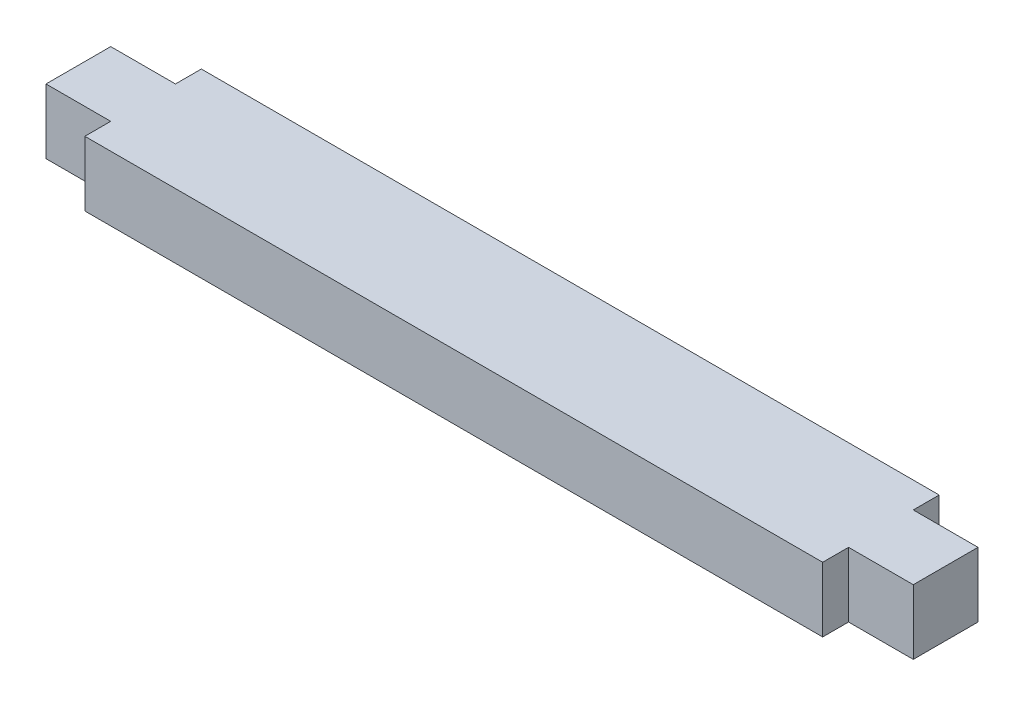
ISO-10303-21;
HEADER;
FILE_DESCRIPTION(('STEP AP214'),'2;1');
FILE_NAME('part.step','',(''),(''),'','','');
FILE_SCHEMA(('AUTOMOTIVE_DESIGN { 1 0 10303 214 1 1 1 1 }'));
ENDSEC;
DATA;
#1=APPLICATION_CONTEXT('core data for automotive mechanical design processes');
#2=APPLICATION_PROTOCOL_DEFINITION('international standard','automotive_design',2000,#1);
#3=PRODUCT_CONTEXT('',#1,'mechanical');
#4=PRODUCT('Part','Part','',(#3));
#5=PRODUCT_RELATED_PRODUCT_CATEGORY('part','',(#4));
#6=PRODUCT_DEFINITION_FORMATION('','',#4);
#7=PRODUCT_DEFINITION_CONTEXT('part definition',#1,'design');
#8=PRODUCT_DEFINITION('design','',#6,#7);
#9=PRODUCT_DEFINITION_SHAPE('','',#8);
#10=(LENGTH_UNIT() NAMED_UNIT(*) SI_UNIT(.MILLI.,.METRE.));
#11=(NAMED_UNIT(*) PLANE_ANGLE_UNIT() SI_UNIT($,.RADIAN.));
#12=(NAMED_UNIT(*) SI_UNIT($,.STERADIAN.) SOLID_ANGLE_UNIT());
#13=UNCERTAINTY_MEASURE_WITH_UNIT(LENGTH_MEASURE(1.E-05),#10,'distance_accuracy_value','');
#14=(GEOMETRIC_REPRESENTATION_CONTEXT(3) GLOBAL_UNCERTAINTY_ASSIGNED_CONTEXT((#13)) GLOBAL_UNIT_ASSIGNED_CONTEXT((#10,
#11,#12)) REPRESENTATION_CONTEXT('',''));
#15=CARTESIAN_POINT('',(0.,0.,0.));
#16=DIRECTION('',(0.,0.,1.));
#17=DIRECTION('',(1.,0.,0.));
#18=AXIS2_PLACEMENT_3D('',#15,#16,#17);
#19=CARTESIAN_POINT('',(36.195,6.35,3.17500000000001));
#20=DIRECTION('',(-1.,0.,0.));
#21=DIRECTION('',(0.,0.,1.));
#22=AXIS2_PLACEMENT_3D('',#19,#20,#21);
#23=PLANE('',#22);
#24=DIRECTION('',(0.,0.,-1.));
#25=VECTOR('',#24,1.);
#26=CARTESIAN_POINT('',(36.195,0.,3.17500000000001));
#27=LINE('',#26,#25);
#28=CARTESIAN_POINT('',(36.195,0.,5.71500000000002));
#29=VERTEX_POINT('',#28);
#30=CARTESIAN_POINT('',(36.195,0.,3.17500000000001));
#31=VERTEX_POINT('',#30);
#32=EDGE_CURVE('E153',#29,#31,#27,.T.);
#33=ORIENTED_EDGE('',*,*,#32,.T.);
#34=DIRECTION('',(0.,-1.,0.));
#35=VECTOR('',#34,1.);
#36=CARTESIAN_POINT('',(36.195,6.35,3.17500000000001));
#37=LINE('',#36,#35);
#38=CARTESIAN_POINT('',(36.195,6.35,3.17500000000001));
#39=VERTEX_POINT('',#38);
#40=EDGE_CURVE('E11',#39,#31,#37,.T.);
#41=ORIENTED_EDGE('',*,*,#40,.F.);
#42=DIRECTION('',(0.,0.,-1.));
#43=VECTOR('',#42,1.);
#44=CARTESIAN_POINT('',(36.195,6.35,3.17500000000001));
#45=LINE('',#44,#43);
#46=CARTESIAN_POINT('',(36.195,6.35,5.71500000000002));
#47=VERTEX_POINT('',#46);
#48=EDGE_CURVE('E175',#47,#39,#45,.T.);
#49=ORIENTED_EDGE('',*,*,#48,.F.);
#50=DIRECTION('',(0.,-1.,0.));
#51=VECTOR('',#50,1.);
#52=CARTESIAN_POINT('',(36.195,6.35,5.71500000000002));
#53=LINE('',#52,#51);
#54=EDGE_CURVE('E149',#47,#29,#53,.T.);
#55=ORIENTED_EDGE('',*,*,#54,.T.);
#56=EDGE_LOOP('',(#33,#41,#49,#55));
#57=FACE_BOUND('',#56,.T.);
#58=ADVANCED_FACE('F33',(#57),#23,.F.);
#59=CARTESIAN_POINT('',(36.195,6.35,3.17500000000001));
#60=DIRECTION('',(0.,0.,-1.));
#61=DIRECTION('',(-1.,0.,0.));
#62=AXIS2_PLACEMENT_3D('',#59,#60,#61);
#63=PLANE('',#62);
#64=DIRECTION('',(1.,0.,0.));
#65=VECTOR('',#64,1.);
#66=CARTESIAN_POINT('',(36.195,0.,3.17500000000001));
#67=LINE('',#66,#65);
#68=CARTESIAN_POINT('',(42.545,0.,3.17500000000001));
#69=VERTEX_POINT('',#68);
#70=EDGE_CURVE('E156',#31,#69,#67,.T.);
#71=ORIENTED_EDGE('',*,*,#70,.T.);
#72=DIRECTION('',(0.,-1.,0.));
#73=VECTOR('',#72,1.);
#74=CARTESIAN_POINT('',(42.545,6.35,3.17500000000001));
#75=LINE('',#74,#73);
#76=CARTESIAN_POINT('',(42.545,6.35,3.17500000000001));
#77=VERTEX_POINT('',#76);
#78=EDGE_CURVE('E41',#77,#69,#75,.T.);
#79=ORIENTED_EDGE('',*,*,#78,.F.);
#80=DIRECTION('',(1.,0.,0.));
#81=VECTOR('',#80,1.);
#82=CARTESIAN_POINT('',(36.195,6.35,3.17500000000001));
#83=LINE('',#82,#81);
#84=EDGE_CURVE('E104',#39,#77,#83,.T.);
#85=ORIENTED_EDGE('',*,*,#84,.F.);
#86=ORIENTED_EDGE('',*,*,#40,.T.);
#87=EDGE_LOOP('',(#71,#79,#85,#86));
#88=FACE_BOUND('',#87,.T.);
#89=ADVANCED_FACE('F253',(#88),#63,.F.);
#90=CARTESIAN_POINT('',(42.545,6.35,-3.17499999999999));
#91=DIRECTION('',(-1.,0.,0.));
#92=DIRECTION('',(0.,0.,1.));
#93=AXIS2_PLACEMENT_3D('',#90,#91,#92);
#94=PLANE('',#93);
#95=DIRECTION('',(0.,0.,-1.));
#96=VECTOR('',#95,1.);
#97=CARTESIAN_POINT('',(42.545,0.,-3.17499999999999));
#98=LINE('',#97,#96);
#99=CARTESIAN_POINT('',(42.545,0.,-3.17499999999999));
#100=VERTEX_POINT('',#99);
#101=EDGE_CURVE('E158',#69,#100,#98,.T.);
#102=ORIENTED_EDGE('',*,*,#101,.T.);
#103=DIRECTION('',(0.,-1.,0.));
#104=VECTOR('',#103,1.);
#105=CARTESIAN_POINT('',(42.545,6.35,-3.17499999999999));
#106=LINE('',#105,#104);
#107=CARTESIAN_POINT('',(42.545,6.35,-3.17499999999999));
#108=VERTEX_POINT('',#107);
#109=EDGE_CURVE('E194',#108,#100,#106,.T.);
#110=ORIENTED_EDGE('',*,*,#109,.F.);
#111=DIRECTION('',(0.,0.,-1.));
#112=VECTOR('',#111,1.);
#113=CARTESIAN_POINT('',(42.545,6.35,-3.17499999999999));
#114=LINE('',#113,#112);
#115=EDGE_CURVE('E202',#77,#108,#114,.T.);
#116=ORIENTED_EDGE('',*,*,#115,.F.);
#117=ORIENTED_EDGE('',*,*,#78,.T.);
#118=EDGE_LOOP('',(#102,#110,#116,#117));
#119=FACE_BOUND('',#118,.T.);
#120=ADVANCED_FACE('F200',(#119),#94,.F.);
#121=CARTESIAN_POINT('',(36.195,6.35,-3.17499999999999));
#122=DIRECTION('',(0.,0.,1.));
#123=DIRECTION('',(1.,0.,0.));
#124=AXIS2_PLACEMENT_3D('',#121,#122,#123);
#125=PLANE('',#124);
#126=DIRECTION('',(-1.,0.,0.));
#127=VECTOR('',#126,1.);
#128=CARTESIAN_POINT('',(36.195,0.,-3.17499999999999));
#129=LINE('',#128,#127);
#130=CARTESIAN_POINT('',(36.195,0.,-3.17499999999999));
#131=VERTEX_POINT('',#130);
#132=EDGE_CURVE('E160',#100,#131,#129,.T.);
#133=ORIENTED_EDGE('',*,*,#132,.T.);
#134=DIRECTION('',(0.,-1.,0.));
#135=VECTOR('',#134,1.);
#136=CARTESIAN_POINT('',(36.195,6.35,-3.17499999999999));
#137=LINE('',#136,#135);
#138=CARTESIAN_POINT('',(36.195,6.35,-3.17499999999999));
#139=VERTEX_POINT('',#138);
#140=EDGE_CURVE('E191',#139,#131,#137,.T.);
#141=ORIENTED_EDGE('',*,*,#140,.F.);
#142=DIRECTION('',(-1.,0.,0.));
#143=VECTOR('',#142,1.);
#144=CARTESIAN_POINT('',(36.195,6.35,-3.17499999999999));
#145=LINE('',#144,#143);
#146=EDGE_CURVE('E220',#108,#139,#145,.T.);
#147=ORIENTED_EDGE('',*,*,#146,.F.);
#148=ORIENTED_EDGE('',*,*,#109,.T.);
#149=EDGE_LOOP('',(#133,#141,#147,#148));
#150=FACE_BOUND('',#149,.T.);
#151=ADVANCED_FACE('F211',(#150),#125,.F.);
#152=CARTESIAN_POINT('',(36.195,6.35,-5.71500000000003));
#153=DIRECTION('',(-1.,0.,0.));
#154=DIRECTION('',(0.,0.,1.));
#155=AXIS2_PLACEMENT_3D('',#152,#153,#154);
#156=PLANE('',#155);
#157=DIRECTION('',(0.,0.,-1.));
#158=VECTOR('',#157,1.);
#159=CARTESIAN_POINT('',(36.195,0.,-5.71500000000003));
#160=LINE('',#159,#158);
#161=CARTESIAN_POINT('',(36.195,0.,-5.71500000000003));
#162=VERTEX_POINT('',#161);
#163=EDGE_CURVE('E162',#131,#162,#160,.T.);
#164=ORIENTED_EDGE('',*,*,#163,.T.);
#165=DIRECTION('',(0.,-1.,0.));
#166=VECTOR('',#165,1.);
#167=CARTESIAN_POINT('',(36.195,6.35,-5.71500000000003));
#168=LINE('',#167,#166);
#169=CARTESIAN_POINT('',(36.195,6.35,-5.71500000000003));
#170=VERTEX_POINT('',#169);
#171=EDGE_CURVE('E188',#170,#162,#168,.T.);
#172=ORIENTED_EDGE('',*,*,#171,.F.);
#173=DIRECTION('',(0.,0.,-1.));
#174=VECTOR('',#173,1.);
#175=CARTESIAN_POINT('',(36.195,6.35,-5.71500000000003));
#176=LINE('',#175,#174);
#177=EDGE_CURVE('E217',#139,#170,#176,.T.);
#178=ORIENTED_EDGE('',*,*,#177,.F.);
#179=ORIENTED_EDGE('',*,*,#140,.T.);
#180=EDGE_LOOP('',(#164,#172,#178,#179));
#181=FACE_BOUND('',#180,.T.);
#182=ADVANCED_FACE('F215',(#181),#156,.F.);
#183=CARTESIAN_POINT('',(-36.195,6.35,-5.71500000000002));
#184=DIRECTION('',(0.,0.,1.));
#185=DIRECTION('',(1.,0.,0.));
#186=AXIS2_PLACEMENT_3D('',#183,#184,#185);
#187=PLANE('',#186);
#188=DIRECTION('',(-1.,0.,0.));
#189=VECTOR('',#188,1.);
#190=CARTESIAN_POINT('',(-36.195,0.,-5.71500000000002));
#191=LINE('',#190,#189);
#192=CARTESIAN_POINT('',(-36.195,0.,-5.71500000000002));
#193=VERTEX_POINT('',#192);
#194=EDGE_CURVE('E164',#162,#193,#191,.T.);
#195=ORIENTED_EDGE('',*,*,#194,.T.);
#196=DIRECTION('',(0.,-1.,0.));
#197=VECTOR('',#196,1.);
#198=CARTESIAN_POINT('',(-36.195,6.35,-5.71500000000002));
#199=LINE('',#198,#197);
#200=CARTESIAN_POINT('',(-36.195,6.35,-5.71500000000002));
#201=VERTEX_POINT('',#200);
#202=EDGE_CURVE('E185',#201,#193,#199,.T.);
#203=ORIENTED_EDGE('',*,*,#202,.F.);
#204=DIRECTION('',(-1.,0.,0.));
#205=VECTOR('',#204,1.);
#206=CARTESIAN_POINT('',(-36.195,6.35,-5.71500000000002));
#207=LINE('',#206,#205);
#208=EDGE_CURVE('E219',#170,#201,#207,.T.);
#209=ORIENTED_EDGE('',*,*,#208,.F.);
#210=ORIENTED_EDGE('',*,*,#171,.T.);
#211=EDGE_LOOP('',(#195,#203,#209,#210));
#212=FACE_BOUND('',#211,.T.);
#213=ADVANCED_FACE('F266',(#212),#187,.F.);
#214=CARTESIAN_POINT('',(-36.195,6.35,-5.71500000000002));
#215=DIRECTION('',(1.,0.,0.));
#216=DIRECTION('',(0.,0.,-1.));
#217=AXIS2_PLACEMENT_3D('',#214,#215,#216);
#218=PLANE('',#217);
#219=DIRECTION('',(0.,0.,1.));
#220=VECTOR('',#219,1.);
#221=CARTESIAN_POINT('',(-36.195,0.,-5.71500000000002));
#222=LINE('',#221,#220);
#223=CARTESIAN_POINT('',(-36.195,0.,-3.17499999999998));
#224=VERTEX_POINT('',#223);
#225=EDGE_CURVE('E166',#193,#224,#222,.T.);
#226=ORIENTED_EDGE('',*,*,#225,.T.);
#227=DIRECTION('',(0.,-1.,0.));
#228=VECTOR('',#227,1.);
#229=CARTESIAN_POINT('',(-36.195,6.35,-3.17499999999998));
#230=LINE('',#229,#228);
#231=CARTESIAN_POINT('',(-36.195,6.35,-3.17499999999998));
#232=VERTEX_POINT('',#231);
#233=EDGE_CURVE('E182',#232,#224,#230,.T.);
#234=ORIENTED_EDGE('',*,*,#233,.F.);
#235=DIRECTION('',(0.,0.,1.));
#236=VECTOR('',#235,1.);
#237=CARTESIAN_POINT('',(-36.195,6.35,-5.71500000000002));
#238=LINE('',#237,#236);
#239=EDGE_CURVE('E222',#201,#232,#238,.T.);
#240=ORIENTED_EDGE('',*,*,#239,.F.);
#241=ORIENTED_EDGE('',*,*,#202,.T.);
#242=EDGE_LOOP('',(#226,#234,#240,#241));
#243=FACE_BOUND('',#242,.T.);
#244=ADVANCED_FACE('F269',(#243),#218,.F.);
#245=CARTESIAN_POINT('',(-36.195,6.35,-3.17499999999998));
#246=DIRECTION('',(0.,0.,1.));
#247=DIRECTION('',(1.,0.,0.));
#248=AXIS2_PLACEMENT_3D('',#245,#246,#247);
#249=PLANE('',#248);
#250=DIRECTION('',(-1.,0.,0.));
#251=VECTOR('',#250,1.);
#252=CARTESIAN_POINT('',(-36.195,0.,-3.17499999999998));
#253=LINE('',#252,#251);
#254=CARTESIAN_POINT('',(-42.545,0.,-3.17499999999998));
#255=VERTEX_POINT('',#254);
#256=EDGE_CURVE('E168',#224,#255,#253,.T.);
#257=ORIENTED_EDGE('',*,*,#256,.T.);
#258=DIRECTION('',(0.,-1.,0.));
#259=VECTOR('',#258,1.);
#260=CARTESIAN_POINT('',(-42.545,6.35,-3.17499999999998));
#261=LINE('',#260,#259);
#262=CARTESIAN_POINT('',(-42.545,6.35,-3.17499999999998));
#263=VERTEX_POINT('',#262);
#264=EDGE_CURVE('E179',#263,#255,#261,.T.);
#265=ORIENTED_EDGE('',*,*,#264,.F.);
#266=DIRECTION('',(-1.,0.,0.));
#267=VECTOR('',#266,1.);
#268=CARTESIAN_POINT('',(-36.195,6.35,-3.17499999999998));
#269=LINE('',#268,#267);
#270=EDGE_CURVE('E228',#232,#263,#269,.T.);
#271=ORIENTED_EDGE('',*,*,#270,.F.);
#272=ORIENTED_EDGE('',*,*,#233,.T.);
#273=EDGE_LOOP('',(#257,#265,#271,#272));
#274=FACE_BOUND('',#273,.T.);
#275=ADVANCED_FACE('F234',(#274),#249,.F.);
#276=CARTESIAN_POINT('',(-42.545,6.35,-3.17499999999998));
#277=DIRECTION('',(1.,0.,0.));
#278=DIRECTION('',(0.,0.,-1.));
#279=AXIS2_PLACEMENT_3D('',#276,#277,#278);
#280=PLANE('',#279);
#281=DIRECTION('',(0.,0.,1.));
#282=VECTOR('',#281,1.);
#283=CARTESIAN_POINT('',(-42.545,0.,-3.17499999999998));
#284=LINE('',#283,#282);
#285=CARTESIAN_POINT('',(-42.545,0.,3.17500000000002));
#286=VERTEX_POINT('',#285);
#287=EDGE_CURVE('E170',#255,#286,#284,.T.);
#288=ORIENTED_EDGE('',*,*,#287,.T.);
#289=DIRECTION('',(0.,-1.,0.));
#290=VECTOR('',#289,1.);
#291=CARTESIAN_POINT('',(-42.545,6.35,3.17500000000002));
#292=LINE('',#291,#290);
#293=CARTESIAN_POINT('',(-42.545,6.35,3.17500000000002));
#294=VERTEX_POINT('',#293);
#295=EDGE_CURVE('E144',#294,#286,#292,.T.);
#296=ORIENTED_EDGE('',*,*,#295,.F.);
#297=DIRECTION('',(0.,0.,1.));
#298=VECTOR('',#297,1.);
#299=CARTESIAN_POINT('',(-42.545,6.35,-3.17499999999998));
#300=LINE('',#299,#298);
#301=EDGE_CURVE('E135',#263,#294,#300,.T.);
#302=ORIENTED_EDGE('',*,*,#301,.F.);
#303=ORIENTED_EDGE('',*,*,#264,.T.);
#304=EDGE_LOOP('',(#288,#296,#302,#303));
#305=FACE_BOUND('',#304,.T.);
#306=ADVANCED_FACE('F238',(#305),#280,.F.);
#307=CARTESIAN_POINT('',(-36.195,6.35,3.17500000000001));
#308=DIRECTION('',(0.,0.,-1.));
#309=DIRECTION('',(-1.,0.,0.));
#310=AXIS2_PLACEMENT_3D('',#307,#308,#309);
#311=PLANE('',#310);
#312=DIRECTION('',(1.,0.,0.));
#313=VECTOR('',#312,1.);
#314=CARTESIAN_POINT('',(-36.195,0.,3.17500000000001));
#315=LINE('',#314,#313);
#316=CARTESIAN_POINT('',(-36.195,0.,3.17500000000001));
#317=VERTEX_POINT('',#316);
#318=EDGE_CURVE('E143',#286,#317,#315,.T.);
#319=ORIENTED_EDGE('',*,*,#318,.T.);
#320=DIRECTION('',(0.,-1.,0.));
#321=VECTOR('',#320,1.);
#322=CARTESIAN_POINT('',(-36.195,6.35,3.17500000000001));
#323=LINE('',#322,#321);
#324=CARTESIAN_POINT('',(-36.195,6.35,3.17500000000001));
#325=VERTEX_POINT('',#324);
#326=EDGE_CURVE('E140',#325,#317,#323,.T.);
#327=ORIENTED_EDGE('',*,*,#326,.F.);
#328=DIRECTION('',(1.,0.,0.));
#329=VECTOR('',#328,1.);
#330=CARTESIAN_POINT('',(-36.195,6.35,3.17500000000001));
#331=LINE('',#330,#329);
#332=EDGE_CURVE('E129',#294,#325,#331,.T.);
#333=ORIENTED_EDGE('',*,*,#332,.F.);
#334=ORIENTED_EDGE('',*,*,#295,.T.);
#335=EDGE_LOOP('',(#319,#327,#333,#334));
#336=FACE_BOUND('',#335,.T.);
#337=ADVANCED_FACE('F141',(#336),#311,.F.);
#338=CARTESIAN_POINT('',(-36.195,6.35,3.17500000000001));
#339=DIRECTION('',(1.,0.,0.));
#340=DIRECTION('',(0.,0.,-1.));
#341=AXIS2_PLACEMENT_3D('',#338,#339,#340);
#342=PLANE('',#341);
#343=DIRECTION('',(0.,0.,1.));
#344=VECTOR('',#343,1.);
#345=CARTESIAN_POINT('',(-36.195,0.,3.17500000000001));
#346=LINE('',#345,#344);
#347=CARTESIAN_POINT('',(-36.195,0.,5.71500000000003));
#348=VERTEX_POINT('',#347);
#349=EDGE_CURVE('E90',#317,#348,#346,.T.);
#350=ORIENTED_EDGE('',*,*,#349,.T.);
#351=DIRECTION('',(0.,-1.,0.));
#352=VECTOR('',#351,1.);
#353=CARTESIAN_POINT('',(-36.195,6.35,5.71500000000003));
#354=LINE('',#353,#352);
#355=CARTESIAN_POINT('',(-36.195,6.35,5.71500000000003));
#356=VERTEX_POINT('',#355);
#357=EDGE_CURVE('E145',#356,#348,#354,.T.);
#358=ORIENTED_EDGE('',*,*,#357,.F.);
#359=DIRECTION('',(0.,0.,1.));
#360=VECTOR('',#359,1.);
#361=CARTESIAN_POINT('',(-36.195,6.35,3.17500000000001));
#362=LINE('',#361,#360);
#363=EDGE_CURVE('E133',#325,#356,#362,.T.);
#364=ORIENTED_EDGE('',*,*,#363,.F.);
#365=ORIENTED_EDGE('',*,*,#326,.T.);
#366=EDGE_LOOP('',(#350,#358,#364,#365));
#367=FACE_BOUND('',#366,.T.);
#368=ADVANCED_FACE('F147',(#367),#342,.F.);
#369=CARTESIAN_POINT('',(-36.195,6.35,5.71500000000003));
#370=DIRECTION('',(0.,0.,-1.));
#371=DIRECTION('',(-1.,0.,0.));
#372=AXIS2_PLACEMENT_3D('',#369,#370,#371);
#373=PLANE('',#372);
#374=DIRECTION('',(1.,0.,0.));
#375=VECTOR('',#374,1.);
#376=CARTESIAN_POINT('',(-36.195,0.,5.71500000000003));
#377=LINE('',#376,#375);
#378=EDGE_CURVE('E96',#348,#29,#377,.T.);
#379=ORIENTED_EDGE('',*,*,#378,.T.);
#380=ORIENTED_EDGE('',*,*,#54,.F.);
#381=DIRECTION('',(1.,0.,0.));
#382=VECTOR('',#381,1.);
#383=CARTESIAN_POINT('',(-36.195,6.35,5.71500000000003));
#384=LINE('',#383,#382);
#385=EDGE_CURVE('E49',#356,#47,#384,.T.);
#386=ORIENTED_EDGE('',*,*,#385,.F.);
#387=ORIENTED_EDGE('',*,*,#357,.T.);
#388=EDGE_LOOP('',(#379,#380,#386,#387));
#389=FACE_BOUND('',#388,.T.);
#390=ADVANCED_FACE('F242',(#389),#373,.F.);
#391=CARTESIAN_POINT('',(0.,6.35,0.));
#392=DIRECTION('',(0.,1.,0.));
#393=DIRECTION('',(0.,0.,1.));
#394=AXIS2_PLACEMENT_3D('',#391,#392,#393);
#395=PLANE('',#394);
#396=ORIENTED_EDGE('',*,*,#48,.T.);
#397=ORIENTED_EDGE('',*,*,#84,.T.);
#398=ORIENTED_EDGE('',*,*,#115,.T.);
#399=ORIENTED_EDGE('',*,*,#146,.T.);
#400=ORIENTED_EDGE('',*,*,#177,.T.);
#401=ORIENTED_EDGE('',*,*,#208,.T.);
#402=ORIENTED_EDGE('',*,*,#239,.T.);
#403=ORIENTED_EDGE('',*,*,#270,.T.);
#404=ORIENTED_EDGE('',*,*,#301,.T.);
#405=ORIENTED_EDGE('',*,*,#332,.T.);
#406=ORIENTED_EDGE('',*,*,#363,.T.);
#407=ORIENTED_EDGE('',*,*,#385,.T.);
#408=EDGE_LOOP('',(#396,#397,#398,#399,#400,#401,#402,#403,#404,#405,#406,#407));
#409=FACE_BOUND('',#408,.T.);
#410=ADVANCED_FACE('F131',(#409),#395,.T.);
#411=CARTESIAN_POINT('',(0.,0.,0.));
#412=DIRECTION('',(0.,1.,0.));
#413=DIRECTION('',(0.,0.,1.));
#414=AXIS2_PLACEMENT_3D('',#411,#412,#413);
#415=PLANE('',#414);
#416=ORIENTED_EDGE('',*,*,#32,.F.);
#417=ORIENTED_EDGE('',*,*,#378,.F.);
#418=ORIENTED_EDGE('',*,*,#349,.F.);
#419=ORIENTED_EDGE('',*,*,#318,.F.);
#420=ORIENTED_EDGE('',*,*,#287,.F.);
#421=ORIENTED_EDGE('',*,*,#256,.F.);
#422=ORIENTED_EDGE('',*,*,#225,.F.);
#423=ORIENTED_EDGE('',*,*,#194,.F.);
#424=ORIENTED_EDGE('',*,*,#163,.F.);
#425=ORIENTED_EDGE('',*,*,#132,.F.);
#426=ORIENTED_EDGE('',*,*,#101,.F.);
#427=ORIENTED_EDGE('',*,*,#70,.F.);
#428=EDGE_LOOP('',(#416,#417,#418,#419,#420,#421,#422,#423,#424,#425,#426,#427));
#429=FACE_BOUND('',#428,.T.);
#430=ADVANCED_FACE('F206',(#429),#415,.F.);
#431=CLOSED_SHELL('',(#58,#89,#120,#151,#182,#213,#244,#275,#306,#337,#368,#390,#410,#430));
#432=MANIFOLD_SOLID_BREP('B2',#431);
#433=ADVANCED_BREP_SHAPE_REPRESENTATION('',(#18,#432),#14);
#434=SHAPE_DEFINITION_REPRESENTATION(#9,#433);
ENDSEC;
END-ISO-10303-21;
